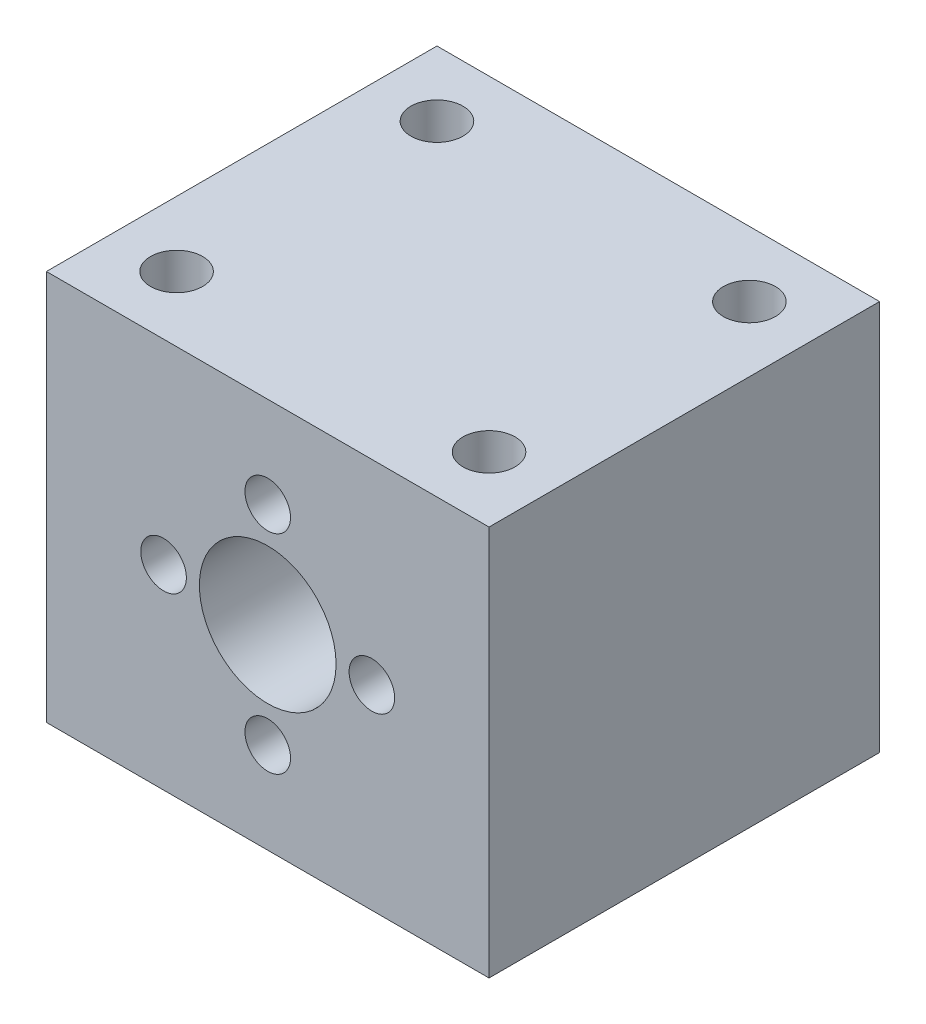
ISO-10303-21;
HEADER;
FILE_DESCRIPTION(('STEP AP214'),'2;1');
FILE_NAME('part.step','',(''),(''),'','','');
FILE_SCHEMA(('AUTOMOTIVE_DESIGN { 1 0 10303 214 1 1 1 1 }'));
ENDSEC;
DATA;
#1=APPLICATION_CONTEXT('core data for automotive mechanical design processes');
#2=APPLICATION_PROTOCOL_DEFINITION('international standard','automotive_design',2000,#1);
#3=PRODUCT_CONTEXT('',#1,'mechanical');
#4=PRODUCT('Part','Part','',(#3));
#5=PRODUCT_RELATED_PRODUCT_CATEGORY('part','',(#4));
#6=PRODUCT_DEFINITION_FORMATION('','',#4);
#7=PRODUCT_DEFINITION_CONTEXT('part definition',#1,'design');
#8=PRODUCT_DEFINITION('design','',#6,#7);
#9=PRODUCT_DEFINITION_SHAPE('','',#8);
#10=(LENGTH_UNIT() NAMED_UNIT(*) SI_UNIT(.MILLI.,.METRE.));
#11=(NAMED_UNIT(*) PLANE_ANGLE_UNIT() SI_UNIT($,.RADIAN.));
#12=(NAMED_UNIT(*) SI_UNIT($,.STERADIAN.) SOLID_ANGLE_UNIT());
#13=UNCERTAINTY_MEASURE_WITH_UNIT(LENGTH_MEASURE(1.E-05),#10,'distance_accuracy_value','');
#14=(GEOMETRIC_REPRESENTATION_CONTEXT(3) GLOBAL_UNCERTAINTY_ASSIGNED_CONTEXT((#13)) GLOBAL_UNIT_ASSIGNED_CONTEXT((#10,
#11,#12)) REPRESENTATION_CONTEXT('',''));
#15=CARTESIAN_POINT('',(0.,0.,0.));
#16=DIRECTION('',(0.,0.,1.));
#17=DIRECTION('',(1.,0.,0.));
#18=AXIS2_PLACEMENT_3D('',#15,#16,#17);
#19=CARTESIAN_POINT('',(0.,0.,30.));
#20=DIRECTION('',(0.,0.,-1.));
#21=DIRECTION('',(-1.,0.,0.));
#22=AXIS2_PLACEMENT_3D('',#19,#20,#21);
#23=PLANE('',#22);
#24=CARTESIAN_POINT('',(-8.,0.,30.));
#25=DIRECTION('',(0.,0.,1.));
#26=DIRECTION('',(1.,0.,0.));
#27=AXIS2_PLACEMENT_3D('',#24,#25,#26);
#28=CIRCLE('',#27,1.75);
#29=CARTESIAN_POINT('',(-6.25,0.,30.));
#30=VERTEX_POINT('',#29);
#31=EDGE_CURVE('E142',#30,#30,#28,.T.);
#32=ORIENTED_EDGE('',*,*,#31,.F.);
#33=EDGE_LOOP('',(#32));
#34=FACE_BOUND('',#33,.T.);
#35=CARTESIAN_POINT('',(0.,8.,30.));
#36=DIRECTION('',(0.,0.,1.));
#37=DIRECTION('',(1.,0.,0.));
#38=AXIS2_PLACEMENT_3D('',#35,#36,#37);
#39=CIRCLE('',#38,1.75);
#40=CARTESIAN_POINT('',(1.75000000000003,8.,30.));
#41=VERTEX_POINT('',#40);
#42=EDGE_CURVE('E136',#41,#41,#39,.T.);
#43=ORIENTED_EDGE('',*,*,#42,.F.);
#44=EDGE_LOOP('',(#43));
#45=FACE_BOUND('',#44,.T.);
#46=CARTESIAN_POINT('',(8.,0.,30.));
#47=DIRECTION('',(0.,0.,1.));
#48=DIRECTION('',(1.,0.,0.));
#49=AXIS2_PLACEMENT_3D('',#46,#47,#48);
#50=CIRCLE('',#49,1.75);
#51=CARTESIAN_POINT('',(9.75,0.,30.));
#52=VERTEX_POINT('',#51);
#53=EDGE_CURVE('E130',#52,#52,#50,.T.);
#54=ORIENTED_EDGE('',*,*,#53,.F.);
#55=EDGE_LOOP('',(#54));
#56=FACE_BOUND('',#55,.T.);
#57=CARTESIAN_POINT('',(0.,-8.,30.));
#58=DIRECTION('',(0.,0.,1.));
#59=DIRECTION('',(1.,0.,0.));
#60=AXIS2_PLACEMENT_3D('',#57,#58,#59);
#61=CIRCLE('',#60,1.75);
#62=CARTESIAN_POINT('',(1.74999999999992,-8.,30.));
#63=VERTEX_POINT('',#62);
#64=EDGE_CURVE('E123',#63,#63,#61,.T.);
#65=ORIENTED_EDGE('',*,*,#64,.F.);
#66=EDGE_LOOP('',(#65));
#67=FACE_BOUND('',#66,.T.);
#68=DIRECTION('',(0.,-1.,0.));
#69=VECTOR('',#68,1.);
#70=CARTESIAN_POINT('',(-17.,15.,30.));
#71=LINE('',#70,#69);
#72=CARTESIAN_POINT('',(-17.,15.,30.));
#73=VERTEX_POINT('',#72);
#74=CARTESIAN_POINT('',(-17.,-15.,30.));
#75=VERTEX_POINT('',#74);
#76=EDGE_CURVE('E90',#73,#75,#71,.T.);
#77=ORIENTED_EDGE('',*,*,#76,.T.);
#78=DIRECTION('',(1.,0.,0.));
#79=VECTOR('',#78,1.);
#80=CARTESIAN_POINT('',(17.,-15.,30.));
#81=LINE('',#80,#79);
#82=CARTESIAN_POINT('',(17.,-15.,30.));
#83=VERTEX_POINT('',#82);
#84=EDGE_CURVE('E85',#75,#83,#81,.T.);
#85=ORIENTED_EDGE('',*,*,#84,.T.);
#86=DIRECTION('',(0.,1.,0.));
#87=VECTOR('',#86,1.);
#88=CARTESIAN_POINT('',(17.,15.,30.));
#89=LINE('',#88,#87);
#90=CARTESIAN_POINT('',(17.,15.,30.));
#91=VERTEX_POINT('',#90);
#92=EDGE_CURVE('E88',#83,#91,#89,.T.);
#93=ORIENTED_EDGE('',*,*,#92,.T.);
#94=DIRECTION('',(-1.,0.,0.));
#95=VECTOR('',#94,1.);
#96=CARTESIAN_POINT('',(17.,15.,30.));
#97=LINE('',#96,#95);
#98=EDGE_CURVE('E55',#91,#73,#97,.T.);
#99=ORIENTED_EDGE('',*,*,#98,.T.);
#100=EDGE_LOOP('',(#77,#85,#93,#99));
#101=FACE_BOUND('',#100,.T.);
#102=CARTESIAN_POINT('',(0.,0.,30.));
#103=DIRECTION('',(0.,0.,1.));
#104=DIRECTION('',(1.,0.,0.));
#105=AXIS2_PLACEMENT_3D('',#102,#103,#104);
#106=CIRCLE('',#105,5.25);
#107=CARTESIAN_POINT('',(5.25,0.,30.));
#108=VERTEX_POINT('',#107);
#109=EDGE_CURVE('E105',#108,#108,#106,.T.);
#110=ORIENTED_EDGE('',*,*,#109,.F.);
#111=EDGE_LOOP('',(#110));
#112=FACE_BOUND('',#111,.T.);
#113=ADVANCED_FACE('F38',(#34,#45,#56,#67,#101,#112),#23,.F.);
#114=CARTESIAN_POINT('',(0.,0.,0.));
#115=DIRECTION('',(0.,0.,-1.));
#116=DIRECTION('',(-1.,0.,0.));
#117=AXIS2_PLACEMENT_3D('',#114,#115,#116);
#118=PLANE('',#117);
#119=DIRECTION('',(0.,-1.,0.));
#120=VECTOR('',#119,1.);
#121=CARTESIAN_POINT('',(-17.,15.,0.));
#122=LINE('',#121,#120);
#123=CARTESIAN_POINT('',(-17.,15.,0.));
#124=VERTEX_POINT('',#123);
#125=CARTESIAN_POINT('',(-17.,-15.,0.));
#126=VERTEX_POINT('',#125);
#127=EDGE_CURVE('E102',#124,#126,#122,.T.);
#128=ORIENTED_EDGE('',*,*,#127,.F.);
#129=DIRECTION('',(-1.,0.,0.));
#130=VECTOR('',#129,1.);
#131=CARTESIAN_POINT('',(17.,15.,0.));
#132=LINE('',#131,#130);
#133=CARTESIAN_POINT('',(17.,15.,0.));
#134=VERTEX_POINT('',#133);
#135=EDGE_CURVE('E78',#134,#124,#132,.T.);
#136=ORIENTED_EDGE('',*,*,#135,.F.);
#137=DIRECTION('',(0.,1.,0.));
#138=VECTOR('',#137,1.);
#139=CARTESIAN_POINT('',(17.,15.,0.));
#140=LINE('',#139,#138);
#141=CARTESIAN_POINT('',(17.,-15.,0.));
#142=VERTEX_POINT('',#141);
#143=EDGE_CURVE('E72',#142,#134,#140,.T.);
#144=ORIENTED_EDGE('',*,*,#143,.F.);
#145=DIRECTION('',(1.,0.,0.));
#146=VECTOR('',#145,1.);
#147=CARTESIAN_POINT('',(17.,-15.,0.));
#148=LINE('',#147,#146);
#149=EDGE_CURVE('E94',#126,#142,#148,.T.);
#150=ORIENTED_EDGE('',*,*,#149,.F.);
#151=EDGE_LOOP('',(#128,#136,#144,#150));
#152=FACE_BOUND('',#151,.T.);
#153=CARTESIAN_POINT('',(0.,0.,0.));
#154=DIRECTION('',(0.,0.,1.));
#155=DIRECTION('',(1.,0.,0.));
#156=AXIS2_PLACEMENT_3D('',#153,#154,#155);
#157=CIRCLE('',#156,5.25);
#158=CARTESIAN_POINT('',(5.25,0.,0.));
#159=VERTEX_POINT('',#158);
#160=EDGE_CURVE('E117',#159,#159,#157,.T.);
#161=ORIENTED_EDGE('',*,*,#160,.T.);
#162=EDGE_LOOP('',(#161));
#163=FACE_BOUND('',#162,.T.);
#164=ADVANCED_FACE('F113',(#152,#163),#118,.T.);
#165=CARTESIAN_POINT('',(-17.,15.,30.));
#166=DIRECTION('',(1.,0.,0.));
#167=DIRECTION('',(0.,1.,0.));
#168=AXIS2_PLACEMENT_3D('',#165,#166,#167);
#169=PLANE('',#168);
#170=ORIENTED_EDGE('',*,*,#127,.T.);
#171=DIRECTION('',(0.,0.,-1.));
#172=VECTOR('',#171,1.);
#173=CARTESIAN_POINT('',(-17.,-15.,30.));
#174=LINE('',#173,#172);
#175=EDGE_CURVE('E11',#75,#126,#174,.T.);
#176=ORIENTED_EDGE('',*,*,#175,.F.);
#177=ORIENTED_EDGE('',*,*,#76,.F.);
#178=DIRECTION('',(0.,0.,-1.));
#179=VECTOR('',#178,1.);
#180=CARTESIAN_POINT('',(-17.,15.,30.));
#181=LINE('',#180,#179);
#182=EDGE_CURVE('E98',#73,#124,#181,.T.);
#183=ORIENTED_EDGE('',*,*,#182,.T.);
#184=EDGE_LOOP('',(#170,#176,#177,#183));
#185=FACE_BOUND('',#184,.T.);
#186=ADVANCED_FACE('F40',(#185),#169,.F.);
#187=CARTESIAN_POINT('',(17.,-15.,30.));
#188=DIRECTION('',(0.,1.,0.));
#189=DIRECTION('',(-1.,0.,0.));
#190=AXIS2_PLACEMENT_3D('',#187,#188,#189);
#191=PLANE('',#190);
#192=CARTESIAN_POINT('',(-1.,-15.,25.));
#193=DIRECTION('',(0.,-1.,0.));
#194=DIRECTION('',(1.,0.,0.));
#195=AXIS2_PLACEMENT_3D('',#192,#193,#194);
#196=CIRCLE('',#195,1.5);
#197=CARTESIAN_POINT('',(0.500000000000002,-15.,25.));
#198=VERTEX_POINT('',#197);
#199=EDGE_CURVE('E177',#198,#198,#196,.T.);
#200=ORIENTED_EDGE('',*,*,#199,.F.);
#201=EDGE_LOOP('',(#200));
#202=FACE_BOUND('',#201,.T.);
#203=CARTESIAN_POINT('',(-6.,-15.,25.));
#204=DIRECTION('',(0.,-1.,0.));
#205=DIRECTION('',(1.,0.,0.));
#206=AXIS2_PLACEMENT_3D('',#203,#204,#205);
#207=CIRCLE('',#206,1.5);
#208=CARTESIAN_POINT('',(-4.5,-15.,25.));
#209=VERTEX_POINT('',#208);
#210=EDGE_CURVE('E171',#209,#209,#207,.T.);
#211=ORIENTED_EDGE('',*,*,#210,.F.);
#212=EDGE_LOOP('',(#211));
#213=FACE_BOUND('',#212,.T.);
#214=ORIENTED_EDGE('',*,*,#149,.T.);
#215=DIRECTION('',(0.,0.,-1.));
#216=VECTOR('',#215,1.);
#217=CARTESIAN_POINT('',(17.,-15.,30.));
#218=LINE('',#217,#216);
#219=EDGE_CURVE('E47',#83,#142,#218,.T.);
#220=ORIENTED_EDGE('',*,*,#219,.F.);
#221=ORIENTED_EDGE('',*,*,#84,.F.);
#222=ORIENTED_EDGE('',*,*,#175,.T.);
#223=EDGE_LOOP('',(#214,#220,#221,#222));
#224=FACE_BOUND('',#223,.T.);
#225=ADVANCED_FACE('F93',(#202,#213,#224),#191,.F.);
#226=CARTESIAN_POINT('',(17.,15.,30.));
#227=DIRECTION('',(-1.,0.,0.));
#228=DIRECTION('',(0.,-1.,0.));
#229=AXIS2_PLACEMENT_3D('',#226,#227,#228);
#230=PLANE('',#229);
#231=ORIENTED_EDGE('',*,*,#143,.T.);
#232=DIRECTION('',(0.,0.,-1.));
#233=VECTOR('',#232,1.);
#234=CARTESIAN_POINT('',(17.,15.,30.));
#235=LINE('',#234,#233);
#236=EDGE_CURVE('E95',#91,#134,#235,.T.);
#237=ORIENTED_EDGE('',*,*,#236,.F.);
#238=ORIENTED_EDGE('',*,*,#92,.F.);
#239=ORIENTED_EDGE('',*,*,#219,.T.);
#240=EDGE_LOOP('',(#231,#237,#238,#239));
#241=FACE_BOUND('',#240,.T.);
#242=ADVANCED_FACE('F96',(#241),#230,.F.);
#243=CARTESIAN_POINT('',(17.,15.,30.));
#244=DIRECTION('',(0.,-1.,0.));
#245=DIRECTION('',(1.,0.,0.));
#246=AXIS2_PLACEMENT_3D('',#243,#244,#245);
#247=PLANE('',#246);
#248=CARTESIAN_POINT('',(12.,15.,5.));
#249=DIRECTION('',(0.,1.,0.));
#250=DIRECTION('',(-1.,0.,0.));
#251=AXIS2_PLACEMENT_3D('',#248,#249,#250);
#252=CIRCLE('',#251,2.);
#253=CARTESIAN_POINT('',(9.99999999999999,15.,5.));
#254=VERTEX_POINT('',#253);
#255=EDGE_CURVE('E153',#254,#254,#252,.T.);
#256=ORIENTED_EDGE('',*,*,#255,.F.);
#257=EDGE_LOOP('',(#256));
#258=FACE_BOUND('',#257,.T.);
#259=CARTESIAN_POINT('',(-12.,15.,5.));
#260=DIRECTION('',(0.,1.,0.));
#261=DIRECTION('',(-1.,0.,0.));
#262=AXIS2_PLACEMENT_3D('',#259,#260,#261);
#263=CIRCLE('',#262,2.);
#264=CARTESIAN_POINT('',(-14.,15.,5.));
#265=VERTEX_POINT('',#264);
#266=EDGE_CURVE('E160',#265,#265,#263,.T.);
#267=ORIENTED_EDGE('',*,*,#266,.F.);
#268=EDGE_LOOP('',(#267));
#269=FACE_BOUND('',#268,.T.);
#270=CARTESIAN_POINT('',(-12.,15.,25.));
#271=DIRECTION('',(0.,1.,0.));
#272=DIRECTION('',(-1.,0.,0.));
#273=AXIS2_PLACEMENT_3D('',#270,#271,#272);
#274=CIRCLE('',#273,2.);
#275=CARTESIAN_POINT('',(-14.,15.,25.));
#276=VERTEX_POINT('',#275);
#277=EDGE_CURVE('E166',#276,#276,#274,.T.);
#278=ORIENTED_EDGE('',*,*,#277,.F.);
#279=EDGE_LOOP('',(#278));
#280=FACE_BOUND('',#279,.T.);
#281=CARTESIAN_POINT('',(12.,15.,25.));
#282=DIRECTION('',(0.,1.,0.));
#283=DIRECTION('',(-1.,0.,0.));
#284=AXIS2_PLACEMENT_3D('',#281,#282,#283);
#285=CIRCLE('',#284,2.);
#286=CARTESIAN_POINT('',(9.99999999999999,15.,25.));
#287=VERTEX_POINT('',#286);
#288=EDGE_CURVE('E147',#287,#287,#285,.T.);
#289=ORIENTED_EDGE('',*,*,#288,.F.);
#290=EDGE_LOOP('',(#289));
#291=FACE_BOUND('',#290,.T.);
#292=ORIENTED_EDGE('',*,*,#135,.T.);
#293=ORIENTED_EDGE('',*,*,#182,.F.);
#294=ORIENTED_EDGE('',*,*,#98,.F.);
#295=ORIENTED_EDGE('',*,*,#236,.T.);
#296=EDGE_LOOP('',(#292,#293,#294,#295));
#297=FACE_BOUND('',#296,.T.);
#298=ADVANCED_FACE('F110',(#258,#269,#280,#291,#297),#247,.F.);
#299=CARTESIAN_POINT('',(0.,0.,30.));
#300=DIRECTION('',(0.,0.,-1.));
#301=DIRECTION('',(-1.,0.,0.));
#302=AXIS2_PLACEMENT_3D('',#299,#300,#301);
#303=CYLINDRICAL_SURFACE('',#302,5.25);
#304=ORIENTED_EDGE('',*,*,#109,.T.);
#305=EDGE_LOOP('',(#304));
#306=FACE_BOUND('',#305,.T.);
#307=ORIENTED_EDGE('',*,*,#160,.F.);
#308=EDGE_LOOP('',(#307));
#309=FACE_BOUND('',#308,.T.);
#310=ADVANCED_FACE('F222',(#306,#309),#303,.F.);
#311=CARTESIAN_POINT('',(0.,-8.,20.));
#312=DIRECTION('',(0.,0.,1.));
#313=DIRECTION('',(1.,0.,0.));
#314=AXIS2_PLACEMENT_3D('',#311,#312,#313);
#315=CYLINDRICAL_SURFACE('',#314,1.75);
#316=CARTESIAN_POINT('',(0.,-8.,20.));
#317=DIRECTION('',(0.,0.,1.));
#318=DIRECTION('',(1.,0.,0.));
#319=AXIS2_PLACEMENT_3D('',#316,#317,#318);
#320=CIRCLE('',#319,1.75);
#321=CARTESIAN_POINT('',(1.74999999999992,-8.,20.));
#322=VERTEX_POINT('',#321);
#323=EDGE_CURVE('E126',#322,#322,#320,.T.);
#324=ORIENTED_EDGE('',*,*,#323,.F.);
#325=EDGE_LOOP('',(#324));
#326=FACE_BOUND('',#325,.T.);
#327=ORIENTED_EDGE('',*,*,#64,.T.);
#328=EDGE_LOOP('',(#327));
#329=FACE_BOUND('',#328,.T.);
#330=ADVANCED_FACE('F248',(#326,#329),#315,.F.);
#331=CARTESIAN_POINT('',(0.,-8.,20.));
#332=DIRECTION('',(0.,0.,1.));
#333=DIRECTION('',(1.,0.,0.));
#334=AXIS2_PLACEMENT_3D('',#331,#332,#333);
#335=PLANE('',#334);
#336=ORIENTED_EDGE('',*,*,#323,.T.);
#337=EDGE_LOOP('',(#336));
#338=FACE_BOUND('',#337,.T.);
#339=ADVANCED_FACE('F255',(#338),#335,.T.);
#340=CARTESIAN_POINT('',(8.,0.,20.));
#341=DIRECTION('',(0.,0.,1.));
#342=DIRECTION('',(1.,0.,0.));
#343=AXIS2_PLACEMENT_3D('',#340,#341,#342);
#344=CYLINDRICAL_SURFACE('',#343,1.75);
#345=CARTESIAN_POINT('',(8.,0.,20.));
#346=DIRECTION('',(0.,0.,1.));
#347=DIRECTION('',(1.,0.,0.));
#348=AXIS2_PLACEMENT_3D('',#345,#346,#347);
#349=CIRCLE('',#348,1.75);
#350=CARTESIAN_POINT('',(9.75,0.,20.));
#351=VERTEX_POINT('',#350);
#352=EDGE_CURVE('E133',#351,#351,#349,.T.);
#353=ORIENTED_EDGE('',*,*,#352,.F.);
#354=EDGE_LOOP('',(#353));
#355=FACE_BOUND('',#354,.T.);
#356=ORIENTED_EDGE('',*,*,#53,.T.);
#357=EDGE_LOOP('',(#356));
#358=FACE_BOUND('',#357,.T.);
#359=ADVANCED_FACE('F262',(#355,#358),#344,.F.);
#360=CARTESIAN_POINT('',(8.,0.,20.));
#361=DIRECTION('',(0.,0.,1.));
#362=DIRECTION('',(1.,0.,0.));
#363=AXIS2_PLACEMENT_3D('',#360,#361,#362);
#364=PLANE('',#363);
#365=ORIENTED_EDGE('',*,*,#352,.T.);
#366=EDGE_LOOP('',(#365));
#367=FACE_BOUND('',#366,.T.);
#368=ADVANCED_FACE('F270',(#367),#364,.T.);
#369=CARTESIAN_POINT('',(0.,8.,20.));
#370=DIRECTION('',(0.,0.,1.));
#371=DIRECTION('',(1.,0.,0.));
#372=AXIS2_PLACEMENT_3D('',#369,#370,#371);
#373=CYLINDRICAL_SURFACE('',#372,1.75);
#374=CARTESIAN_POINT('',(0.,8.,20.));
#375=DIRECTION('',(0.,0.,1.));
#376=DIRECTION('',(1.,0.,0.));
#377=AXIS2_PLACEMENT_3D('',#374,#375,#376);
#378=CIRCLE('',#377,1.75);
#379=CARTESIAN_POINT('',(1.75000000000003,8.,20.));
#380=VERTEX_POINT('',#379);
#381=EDGE_CURVE('E139',#380,#380,#378,.T.);
#382=ORIENTED_EDGE('',*,*,#381,.F.);
#383=EDGE_LOOP('',(#382));
#384=FACE_BOUND('',#383,.T.);
#385=ORIENTED_EDGE('',*,*,#42,.T.);
#386=EDGE_LOOP('',(#385));
#387=FACE_BOUND('',#386,.T.);
#388=ADVANCED_FACE('F278',(#384,#387),#373,.F.);
#389=CARTESIAN_POINT('',(0.,8.,20.));
#390=DIRECTION('',(0.,0.,1.));
#391=DIRECTION('',(1.,0.,0.));
#392=AXIS2_PLACEMENT_3D('',#389,#390,#391);
#393=PLANE('',#392);
#394=ORIENTED_EDGE('',*,*,#381,.T.);
#395=EDGE_LOOP('',(#394));
#396=FACE_BOUND('',#395,.T.);
#397=ADVANCED_FACE('F286',(#396),#393,.T.);
#398=CARTESIAN_POINT('',(-8.,0.,20.));
#399=DIRECTION('',(0.,0.,1.));
#400=DIRECTION('',(1.,0.,0.));
#401=AXIS2_PLACEMENT_3D('',#398,#399,#400);
#402=CYLINDRICAL_SURFACE('',#401,1.75);
#403=CARTESIAN_POINT('',(-8.,0.,20.));
#404=DIRECTION('',(0.,0.,1.));
#405=DIRECTION('',(1.,0.,0.));
#406=AXIS2_PLACEMENT_3D('',#403,#404,#405);
#407=CIRCLE('',#406,1.75);
#408=CARTESIAN_POINT('',(-6.25,0.,20.));
#409=VERTEX_POINT('',#408);
#410=EDGE_CURVE('E120',#409,#409,#407,.T.);
#411=ORIENTED_EDGE('',*,*,#410,.F.);
#412=EDGE_LOOP('',(#411));
#413=FACE_BOUND('',#412,.T.);
#414=ORIENTED_EDGE('',*,*,#31,.T.);
#415=EDGE_LOOP('',(#414));
#416=FACE_BOUND('',#415,.T.);
#417=ADVANCED_FACE('F294',(#413,#416),#402,.F.);
#418=CARTESIAN_POINT('',(-8.,0.,20.));
#419=DIRECTION('',(0.,0.,1.));
#420=DIRECTION('',(1.,0.,0.));
#421=AXIS2_PLACEMENT_3D('',#418,#419,#420);
#422=PLANE('',#421);
#423=ORIENTED_EDGE('',*,*,#410,.T.);
#424=EDGE_LOOP('',(#423));
#425=FACE_BOUND('',#424,.T.);
#426=ADVANCED_FACE('F302',(#425),#422,.T.);
#427=CARTESIAN_POINT('',(12.,5.,25.));
#428=DIRECTION('',(0.,1.,0.));
#429=DIRECTION('',(-1.,0.,0.));
#430=AXIS2_PLACEMENT_3D('',#427,#428,#429);
#431=CYLINDRICAL_SURFACE('',#430,2.);
#432=CARTESIAN_POINT('',(12.,5.,25.));
#433=DIRECTION('',(0.,1.,0.));
#434=DIRECTION('',(-1.,0.,0.));
#435=AXIS2_PLACEMENT_3D('',#432,#433,#434);
#436=CIRCLE('',#435,2.);
#437=CARTESIAN_POINT('',(9.99999999999999,5.,25.));
#438=VERTEX_POINT('',#437);
#439=EDGE_CURVE('E127',#438,#438,#436,.T.);
#440=ORIENTED_EDGE('',*,*,#439,.F.);
#441=EDGE_LOOP('',(#440));
#442=FACE_BOUND('',#441,.T.);
#443=ORIENTED_EDGE('',*,*,#288,.T.);
#444=EDGE_LOOP('',(#443));
#445=FACE_BOUND('',#444,.T.);
#446=ADVANCED_FACE('F309',(#442,#445),#431,.F.);
#447=CARTESIAN_POINT('',(12.,5.,25.));
#448=DIRECTION('',(0.,1.,0.));
#449=DIRECTION('',(-1.,0.,0.));
#450=AXIS2_PLACEMENT_3D('',#447,#448,#449);
#451=PLANE('',#450);
#452=ORIENTED_EDGE('',*,*,#439,.T.);
#453=EDGE_LOOP('',(#452));
#454=FACE_BOUND('',#453,.T.);
#455=ADVANCED_FACE('F316',(#454),#451,.T.);
#456=CARTESIAN_POINT('',(-12.,5.,25.));
#457=DIRECTION('',(0.,1.,0.));
#458=DIRECTION('',(-1.,0.,0.));
#459=AXIS2_PLACEMENT_3D('',#456,#457,#458);
#460=CYLINDRICAL_SURFACE('',#459,2.);
#461=CARTESIAN_POINT('',(-12.,5.,25.));
#462=DIRECTION('',(0.,1.,0.));
#463=DIRECTION('',(-1.,0.,0.));
#464=AXIS2_PLACEMENT_3D('',#461,#462,#463);
#465=CIRCLE('',#464,2.);
#466=CARTESIAN_POINT('',(-14.,5.,25.));
#467=VERTEX_POINT('',#466);
#468=EDGE_CURVE('E150',#467,#467,#465,.T.);
#469=ORIENTED_EDGE('',*,*,#468,.F.);
#470=EDGE_LOOP('',(#469));
#471=FACE_BOUND('',#470,.T.);
#472=ORIENTED_EDGE('',*,*,#277,.T.);
#473=EDGE_LOOP('',(#472));
#474=FACE_BOUND('',#473,.T.);
#475=ADVANCED_FACE('F324',(#471,#474),#460,.F.);
#476=CARTESIAN_POINT('',(-12.,5.,25.));
#477=DIRECTION('',(0.,1.,0.));
#478=DIRECTION('',(-1.,0.,0.));
#479=AXIS2_PLACEMENT_3D('',#476,#477,#478);
#480=PLANE('',#479);
#481=ORIENTED_EDGE('',*,*,#468,.T.);
#482=EDGE_LOOP('',(#481));
#483=FACE_BOUND('',#482,.T.);
#484=ADVANCED_FACE('F332',(#483),#480,.T.);
#485=CARTESIAN_POINT('',(-12.,5.,5.));
#486=DIRECTION('',(0.,1.,0.));
#487=DIRECTION('',(-1.,0.,0.));
#488=AXIS2_PLACEMENT_3D('',#485,#486,#487);
#489=CYLINDRICAL_SURFACE('',#488,2.);
#490=CARTESIAN_POINT('',(-12.,5.,5.));
#491=DIRECTION('',(0.,1.,0.));
#492=DIRECTION('',(-1.,0.,0.));
#493=AXIS2_PLACEMENT_3D('',#490,#491,#492);
#494=CIRCLE('',#493,2.);
#495=CARTESIAN_POINT('',(-14.,5.,5.));
#496=VERTEX_POINT('',#495);
#497=EDGE_CURVE('E163',#496,#496,#494,.T.);
#498=ORIENTED_EDGE('',*,*,#497,.F.);
#499=EDGE_LOOP('',(#498));
#500=FACE_BOUND('',#499,.T.);
#501=ORIENTED_EDGE('',*,*,#266,.T.);
#502=EDGE_LOOP('',(#501));
#503=FACE_BOUND('',#502,.T.);
#504=ADVANCED_FACE('F340',(#500,#503),#489,.F.);
#505=CARTESIAN_POINT('',(-12.,5.,5.));
#506=DIRECTION('',(0.,1.,0.));
#507=DIRECTION('',(-1.,0.,0.));
#508=AXIS2_PLACEMENT_3D('',#505,#506,#507);
#509=PLANE('',#508);
#510=ORIENTED_EDGE('',*,*,#497,.T.);
#511=EDGE_LOOP('',(#510));
#512=FACE_BOUND('',#511,.T.);
#513=ADVANCED_FACE('F347',(#512),#509,.T.);
#514=CARTESIAN_POINT('',(12.,5.,5.));
#515=DIRECTION('',(0.,1.,0.));
#516=DIRECTION('',(-1.,0.,0.));
#517=AXIS2_PLACEMENT_3D('',#514,#515,#516);
#518=CYLINDRICAL_SURFACE('',#517,2.);
#519=CARTESIAN_POINT('',(12.,5.,5.));
#520=DIRECTION('',(0.,1.,0.));
#521=DIRECTION('',(-1.,0.,0.));
#522=AXIS2_PLACEMENT_3D('',#519,#520,#521);
#523=CIRCLE('',#522,2.);
#524=CARTESIAN_POINT('',(9.99999999999999,5.,5.));
#525=VERTEX_POINT('',#524);
#526=EDGE_CURVE('E156',#525,#525,#523,.T.);
#527=ORIENTED_EDGE('',*,*,#526,.F.);
#528=EDGE_LOOP('',(#527));
#529=FACE_BOUND('',#528,.T.);
#530=ORIENTED_EDGE('',*,*,#255,.T.);
#531=EDGE_LOOP('',(#530));
#532=FACE_BOUND('',#531,.T.);
#533=ADVANCED_FACE('F207',(#529,#532),#518,.F.);
#534=CARTESIAN_POINT('',(12.,5.,5.));
#535=DIRECTION('',(0.,1.,0.));
#536=DIRECTION('',(-1.,0.,0.));
#537=AXIS2_PLACEMENT_3D('',#534,#535,#536);
#538=PLANE('',#537);
#539=ORIENTED_EDGE('',*,*,#526,.T.);
#540=EDGE_LOOP('',(#539));
#541=FACE_BOUND('',#540,.T.);
#542=ADVANCED_FACE('F198',(#541),#538,.T.);
#543=CARTESIAN_POINT('',(-6.,-10.,25.));
#544=DIRECTION('',(0.,-1.,0.));
#545=DIRECTION('',(1.,0.,0.));
#546=AXIS2_PLACEMENT_3D('',#543,#544,#545);
#547=CYLINDRICAL_SURFACE('',#546,1.5);
#548=CARTESIAN_POINT('',(-6.,-10.,25.));
#549=DIRECTION('',(0.,-1.,0.));
#550=DIRECTION('',(1.,0.,0.));
#551=AXIS2_PLACEMENT_3D('',#548,#549,#550);
#552=CIRCLE('',#551,1.5);
#553=CARTESIAN_POINT('',(-4.5,-10.,25.));
#554=VERTEX_POINT('',#553);
#555=EDGE_CURVE('E174',#554,#554,#552,.T.);
#556=ORIENTED_EDGE('',*,*,#555,.F.);
#557=EDGE_LOOP('',(#556));
#558=FACE_BOUND('',#557,.T.);
#559=ORIENTED_EDGE('',*,*,#210,.T.);
#560=EDGE_LOOP('',(#559));
#561=FACE_BOUND('',#560,.T.);
#562=ADVANCED_FACE('F196',(#558,#561),#547,.F.);
#563=CARTESIAN_POINT('',(-6.,-10.,25.));
#564=DIRECTION('',(0.,-1.,0.));
#565=DIRECTION('',(1.,0.,0.));
#566=AXIS2_PLACEMENT_3D('',#563,#564,#565);
#567=PLANE('',#566);
#568=ORIENTED_EDGE('',*,*,#555,.T.);
#569=EDGE_LOOP('',(#568));
#570=FACE_BOUND('',#569,.T.);
#571=ADVANCED_FACE('F188',(#570),#567,.T.);
#572=CARTESIAN_POINT('',(-1.,-10.,25.));
#573=DIRECTION('',(0.,-1.,0.));
#574=DIRECTION('',(1.,0.,0.));
#575=AXIS2_PLACEMENT_3D('',#572,#573,#574);
#576=CYLINDRICAL_SURFACE('',#575,1.5);
#577=CARTESIAN_POINT('',(-1.,-10.,25.));
#578=DIRECTION('',(0.,-1.,0.));
#579=DIRECTION('',(1.,0.,0.));
#580=AXIS2_PLACEMENT_3D('',#577,#578,#579);
#581=CIRCLE('',#580,1.5);
#582=CARTESIAN_POINT('',(0.500000000000001,-10.,25.));
#583=VERTEX_POINT('',#582);
#584=EDGE_CURVE('E157',#583,#583,#581,.T.);
#585=ORIENTED_EDGE('',*,*,#584,.F.);
#586=EDGE_LOOP('',(#585));
#587=FACE_BOUND('',#586,.T.);
#588=ORIENTED_EDGE('',*,*,#199,.T.);
#589=EDGE_LOOP('',(#588));
#590=FACE_BOUND('',#589,.T.);
#591=ADVANCED_FACE('F185',(#587,#590),#576,.F.);
#592=CARTESIAN_POINT('',(-1.,-10.,25.));
#593=DIRECTION('',(0.,-1.,0.));
#594=DIRECTION('',(1.,0.,0.));
#595=AXIS2_PLACEMENT_3D('',#592,#593,#594);
#596=PLANE('',#595);
#597=ORIENTED_EDGE('',*,*,#584,.T.);
#598=EDGE_LOOP('',(#597));
#599=FACE_BOUND('',#598,.T.);
#600=ADVANCED_FACE('F183',(#599),#596,.T.);
#601=CLOSED_SHELL('',(#113,#164,#186,#225,#242,#298,#310,#330,#339,#359,#368,#388,#397,#417,
#426,#446,#455,#475,#484,#504,#513,#533,#542,#562,#571,#591,#600));
#602=MANIFOLD_SOLID_BREP('B2',#601);
#603=ADVANCED_BREP_SHAPE_REPRESENTATION('',(#18,#602),#14);
#604=SHAPE_DEFINITION_REPRESENTATION(#9,#603);
ENDSEC;
END-ISO-10303-21;
